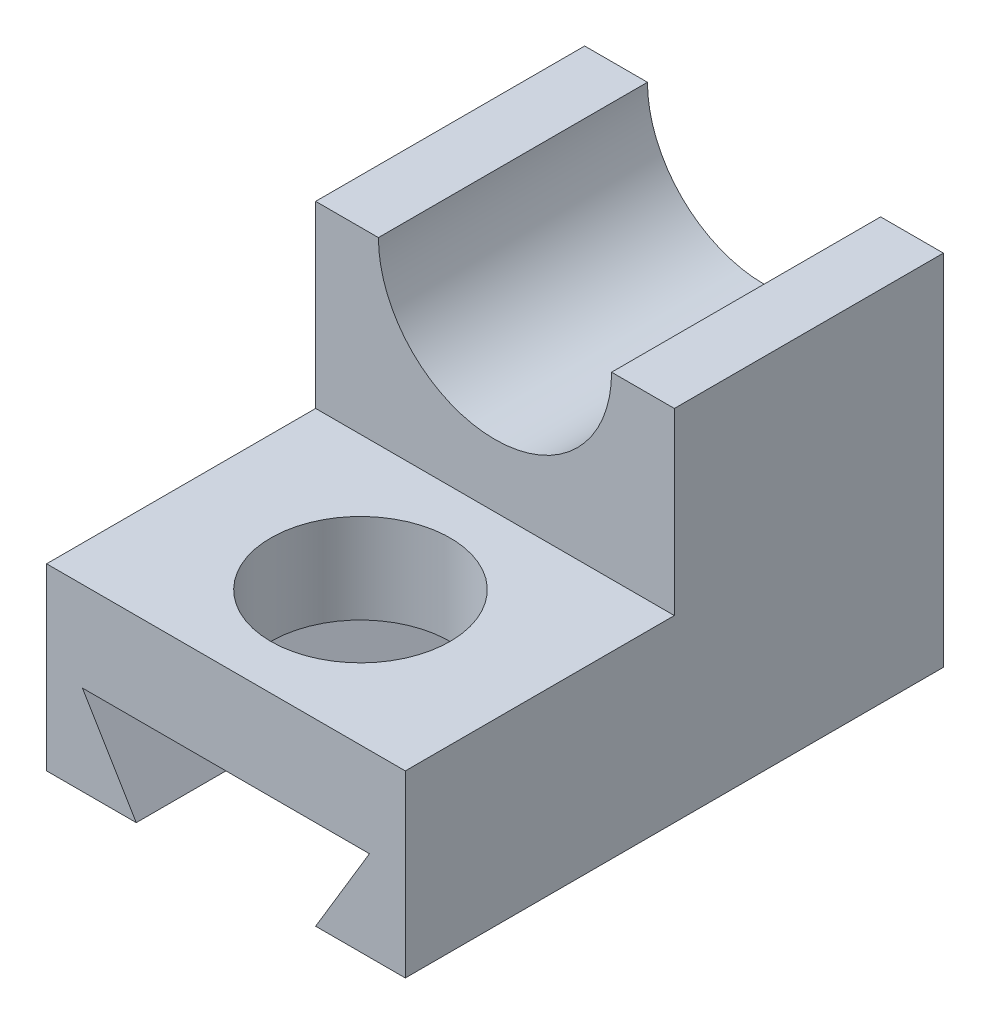
ISO-10303-21;
HEADER;
FILE_DESCRIPTION(('STEP AP214'),'2;1');
FILE_NAME('part.step','',(''),(''),'','','');
FILE_SCHEMA(('AUTOMOTIVE_DESIGN { 1 0 10303 214 1 1 1 1 }'));
ENDSEC;
DATA;
#1=APPLICATION_CONTEXT('core data for automotive mechanical design processes');
#2=APPLICATION_PROTOCOL_DEFINITION('international standard','automotive_design',2000,#1);
#3=PRODUCT_CONTEXT('',#1,'mechanical');
#4=PRODUCT('Part','Part','',(#3));
#5=PRODUCT_RELATED_PRODUCT_CATEGORY('part','',(#4));
#6=PRODUCT_DEFINITION_FORMATION('','',#4);
#7=PRODUCT_DEFINITION_CONTEXT('part definition',#1,'design');
#8=PRODUCT_DEFINITION('design','',#6,#7);
#9=PRODUCT_DEFINITION_SHAPE('','',#8);
#10=(LENGTH_UNIT() NAMED_UNIT(*) SI_UNIT(.MILLI.,.METRE.));
#11=(NAMED_UNIT(*) PLANE_ANGLE_UNIT() SI_UNIT($,.RADIAN.));
#12=(NAMED_UNIT(*) SI_UNIT($,.STERADIAN.) SOLID_ANGLE_UNIT());
#13=UNCERTAINTY_MEASURE_WITH_UNIT(LENGTH_MEASURE(1.E-05),#10,'distance_accuracy_value','');
#14=(GEOMETRIC_REPRESENTATION_CONTEXT(3) GLOBAL_UNCERTAINTY_ASSIGNED_CONTEXT((#13)) GLOBAL_UNIT_ASSIGNED_CONTEXT((#10,
#11,#12)) REPRESENTATION_CONTEXT('',''));
#15=CARTESIAN_POINT('',(0.,0.,0.));
#16=DIRECTION('',(0.,0.,1.));
#17=DIRECTION('',(1.,0.,0.));
#18=AXIS2_PLACEMENT_3D('',#15,#16,#17);
#19=CARTESIAN_POINT('',(20.,40.,-30.));
#20=DIRECTION('',(0.,-1.,0.));
#21=DIRECTION('',(0.,0.,-1.));
#22=AXIS2_PLACEMENT_3D('',#19,#20,#21);
#23=PLANE('',#22);
#24=DIRECTION('',(-1.,0.,0.));
#25=VECTOR('',#24,1.);
#26=CARTESIAN_POINT('',(20.,40.,-60.));
#27=LINE('',#26,#25);
#28=CARTESIAN_POINT('',(20.,40.,-60.));
#29=VERTEX_POINT('',#28);
#30=CARTESIAN_POINT('',(13.,40.,-60.));
#31=VERTEX_POINT('',#30);
#32=EDGE_CURVE('E154',#29,#31,#27,.T.);
#33=ORIENTED_EDGE('',*,*,#32,.T.);
#34=DIRECTION('',(0.,0.,1.));
#35=VECTOR('',#34,1.);
#36=CARTESIAN_POINT('',(13.,40.,-60.));
#37=LINE('',#36,#35);
#38=CARTESIAN_POINT('',(13.,40.,-30.));
#39=VERTEX_POINT('',#38);
#40=EDGE_CURVE('E139',#31,#39,#37,.T.);
#41=ORIENTED_EDGE('',*,*,#40,.T.);
#42=DIRECTION('',(-1.,0.,0.));
#43=VECTOR('',#42,1.);
#44=CARTESIAN_POINT('',(20.,40.,-30.));
#45=LINE('',#44,#43);
#46=CARTESIAN_POINT('',(20.,40.,-30.));
#47=VERTEX_POINT('',#46);
#48=EDGE_CURVE('E164',#47,#39,#45,.T.);
#49=ORIENTED_EDGE('',*,*,#48,.F.);
#50=DIRECTION('',(0.,0.,1.));
#51=VECTOR('',#50,1.);
#52=CARTESIAN_POINT('',(20.,40.,-30.));
#53=LINE('',#52,#51);
#54=EDGE_CURVE('E160',#29,#47,#53,.T.);
#55=ORIENTED_EDGE('',*,*,#54,.F.);
#56=EDGE_LOOP('',(#33,#41,#49,#55));
#57=FACE_BOUND('',#56,.T.);
#58=ADVANCED_FACE('F45',(#57),#23,.F.);
#59=CARTESIAN_POINT('',(20.,0.,0.));
#60=DIRECTION('',(0.,1.,0.));
#61=DIRECTION('',(0.,0.,1.));
#62=AXIS2_PLACEMENT_3D('',#59,#60,#61);
#63=PLANE('',#62);
#64=DIRECTION('',(-1.,0.,0.));
#65=VECTOR('',#64,1.);
#66=CARTESIAN_POINT('',(20.,0.,-60.));
#67=LINE('',#66,#65);
#68=CARTESIAN_POINT('',(-10.,0.,-60.));
#69=VERTEX_POINT('',#68);
#70=CARTESIAN_POINT('',(-20.,0.,-60.));
#71=VERTEX_POINT('',#70);
#72=EDGE_CURVE('E54',#69,#71,#67,.T.);
#73=ORIENTED_EDGE('',*,*,#72,.F.);
#74=DIRECTION('',(0.,0.,1.));
#75=VECTOR('',#74,1.);
#76=CARTESIAN_POINT('',(-10.,0.,-60.));
#77=LINE('',#76,#75);
#78=CARTESIAN_POINT('',(-10.,0.,-15.));
#79=VERTEX_POINT('',#78);
#80=EDGE_CURVE('E204',#69,#79,#77,.T.);
#81=ORIENTED_EDGE('',*,*,#80,.T.);
#82=CARTESIAN_POINT('',(-10.,0.,0.));
#83=VERTEX_POINT('',#82);
#84=EDGE_CURVE('E69',#79,#83,#77,.T.);
#85=ORIENTED_EDGE('',*,*,#84,.T.);
#86=DIRECTION('',(-1.,0.,0.));
#87=VECTOR('',#86,1.);
#88=CARTESIAN_POINT('',(20.,0.,0.));
#89=LINE('',#88,#87);
#90=CARTESIAN_POINT('',(-20.,0.,0.));
#91=VERTEX_POINT('',#90);
#92=EDGE_CURVE('E181',#83,#91,#89,.T.);
#93=ORIENTED_EDGE('',*,*,#92,.T.);
#94=DIRECTION('',(0.,0.,-1.));
#95=VECTOR('',#94,1.);
#96=CARTESIAN_POINT('',(-20.,0.,0.));
#97=LINE('',#96,#95);
#98=EDGE_CURVE('E200',#91,#71,#97,.T.);
#99=ORIENTED_EDGE('',*,*,#98,.T.);
#100=EDGE_LOOP('',(#73,#81,#85,#93,#99));
#101=FACE_BOUND('',#100,.T.);
#102=ADVANCED_FACE('F313',(#101),#63,.F.);
#103=CARTESIAN_POINT('',(20.,0.,0.));
#104=VERTEX_POINT('',#103);
#105=CARTESIAN_POINT('',(10.,0.,0.));
#106=VERTEX_POINT('',#105);
#107=EDGE_CURVE('E177',#104,#106,#89,.T.);
#108=ORIENTED_EDGE('',*,*,#107,.T.);
#109=DIRECTION('',(0.,0.,1.));
#110=VECTOR('',#109,1.);
#111=CARTESIAN_POINT('',(10.,0.,-60.));
#112=LINE('',#111,#110);
#113=CARTESIAN_POINT('',(10.,0.,-15.));
#114=VERTEX_POINT('',#113);
#115=EDGE_CURVE('E227',#114,#106,#112,.T.);
#116=ORIENTED_EDGE('',*,*,#115,.F.);
#117=CARTESIAN_POINT('',(10.,0.,-60.));
#118=VERTEX_POINT('',#117);
#119=EDGE_CURVE('E222',#118,#114,#112,.T.);
#120=ORIENTED_EDGE('',*,*,#119,.F.);
#121=CARTESIAN_POINT('',(20.,0.,-60.));
#122=VERTEX_POINT('',#121);
#123=EDGE_CURVE('E11',#122,#118,#67,.T.);
#124=ORIENTED_EDGE('',*,*,#123,.F.);
#125=DIRECTION('',(0.,0.,-1.));
#126=VECTOR('',#125,1.);
#127=CARTESIAN_POINT('',(20.,0.,0.));
#128=LINE('',#127,#126);
#129=EDGE_CURVE('E186',#104,#122,#128,.T.);
#130=ORIENTED_EDGE('',*,*,#129,.F.);
#131=EDGE_LOOP('',(#108,#116,#120,#124,#130));
#132=FACE_BOUND('',#131,.T.);
#133=ADVANCED_FACE('F47',(#132),#63,.F.);
#134=CARTESIAN_POINT('',(20.,0.,-60.));
#135=DIRECTION('',(0.,0.,1.));
#136=DIRECTION('',(1.,0.,0.));
#137=AXIS2_PLACEMENT_3D('',#134,#135,#136);
#138=PLANE('',#137);
#139=CARTESIAN_POINT('',(-13.,40.,-60.));
#140=VERTEX_POINT('',#139);
#141=CARTESIAN_POINT('',(-20.,40.,-60.));
#142=VERTEX_POINT('',#141);
#143=EDGE_CURVE('E157',#140,#142,#27,.T.);
#144=ORIENTED_EDGE('',*,*,#143,.F.);
#145=CARTESIAN_POINT('',(0.,40.,-60.));
#146=DIRECTION('',(0.,0.,1.));
#147=DIRECTION('',(1.,0.,0.));
#148=AXIS2_PLACEMENT_3D('',#145,#146,#147);
#149=CIRCLE('',#148,13.);
#150=EDGE_CURVE('E142',#140,#31,#149,.T.);
#151=ORIENTED_EDGE('',*,*,#150,.T.);
#152=ORIENTED_EDGE('',*,*,#32,.F.);
#153=DIRECTION('',(0.,1.,0.));
#154=VECTOR('',#153,1.);
#155=CARTESIAN_POINT('',(20.,0.,-60.));
#156=LINE('',#155,#154);
#157=EDGE_CURVE('E216',#122,#29,#156,.T.);
#158=ORIENTED_EDGE('',*,*,#157,.F.);
#159=ORIENTED_EDGE('',*,*,#123,.T.);
#160=DIRECTION('',(0.514495755427527,0.857492925712544,0.));
#161=VECTOR('',#160,1.);
#162=CARTESIAN_POINT('',(10.,0.,-60.));
#163=LINE('',#162,#161);
#164=CARTESIAN_POINT('',(16.,10.,-60.));
#165=VERTEX_POINT('',#164);
#166=EDGE_CURVE('E238',#118,#165,#163,.T.);
#167=ORIENTED_EDGE('',*,*,#166,.T.);
#168=DIRECTION('',(-1.,0.,0.));
#169=VECTOR('',#168,1.);
#170=CARTESIAN_POINT('',(16.,10.,-60.));
#171=LINE('',#170,#169);
#172=CARTESIAN_POINT('',(-16.,10.,-60.));
#173=VERTEX_POINT('',#172);
#174=EDGE_CURVE('E252',#165,#173,#171,.T.);
#175=ORIENTED_EDGE('',*,*,#174,.T.);
#176=DIRECTION('',(0.514495755427527,-0.857492925712544,0.));
#177=VECTOR('',#176,1.);
#178=CARTESIAN_POINT('',(-10.,0.,-60.));
#179=LINE('',#178,#177);
#180=EDGE_CURVE('E248',#173,#69,#179,.T.);
#181=ORIENTED_EDGE('',*,*,#180,.T.);
#182=ORIENTED_EDGE('',*,*,#72,.T.);
#183=DIRECTION('',(0.,1.,0.));
#184=VECTOR('',#183,1.);
#185=CARTESIAN_POINT('',(-20.,0.,-60.));
#186=LINE('',#185,#184);
#187=EDGE_CURVE('E197',#71,#142,#186,.T.);
#188=ORIENTED_EDGE('',*,*,#187,.T.);
#189=EDGE_LOOP('',(#144,#151,#152,#158,#159,#167,#175,#181,#182,#188));
#190=FACE_BOUND('',#189,.T.);
#191=ADVANCED_FACE('F153',(#190),#138,.F.);
#192=CARTESIAN_POINT('',(-13.,40.,-30.));
#193=VERTEX_POINT('',#192);
#194=CARTESIAN_POINT('',(-20.,40.,-30.));
#195=VERTEX_POINT('',#194);
#196=EDGE_CURVE('E168',#193,#195,#45,.T.);
#197=ORIENTED_EDGE('',*,*,#196,.F.);
#198=DIRECTION('',(0.,0.,1.));
#199=VECTOR('',#198,1.);
#200=CARTESIAN_POINT('',(-13.,40.,-60.));
#201=LINE('',#200,#199);
#202=EDGE_CURVE('E61',#140,#193,#201,.T.);
#203=ORIENTED_EDGE('',*,*,#202,.F.);
#204=ORIENTED_EDGE('',*,*,#143,.T.);
#205=DIRECTION('',(0.,0.,1.));
#206=VECTOR('',#205,1.);
#207=CARTESIAN_POINT('',(-20.,40.,-30.));
#208=LINE('',#207,#206);
#209=EDGE_CURVE('E193',#142,#195,#208,.T.);
#210=ORIENTED_EDGE('',*,*,#209,.T.);
#211=EDGE_LOOP('',(#197,#203,#204,#210));
#212=FACE_BOUND('',#211,.T.);
#213=ADVANCED_FACE('F280',(#212),#23,.F.);
#214=CARTESIAN_POINT('',(20.,20.,-30.));
#215=DIRECTION('',(0.,0.,-1.));
#216=DIRECTION('',(-1.,0.,0.));
#217=AXIS2_PLACEMENT_3D('',#214,#215,#216);
#218=PLANE('',#217);
#219=ORIENTED_EDGE('',*,*,#48,.T.);
#220=CARTESIAN_POINT('',(0.,40.,-30.));
#221=DIRECTION('',(0.,0.,1.));
#222=DIRECTION('',(1.,0.,0.));
#223=AXIS2_PLACEMENT_3D('',#220,#221,#222);
#224=CIRCLE('',#223,13.);
#225=EDGE_CURVE('E143',#193,#39,#224,.T.);
#226=ORIENTED_EDGE('',*,*,#225,.F.);
#227=ORIENTED_EDGE('',*,*,#196,.T.);
#228=DIRECTION('',(0.,-1.,0.));
#229=VECTOR('',#228,1.);
#230=CARTESIAN_POINT('',(-20.,20.,-30.));
#231=LINE('',#230,#229);
#232=CARTESIAN_POINT('',(-20.,20.,-30.));
#233=VERTEX_POINT('',#232);
#234=EDGE_CURVE('E190',#195,#233,#231,.T.);
#235=ORIENTED_EDGE('',*,*,#234,.T.);
#236=DIRECTION('',(-1.,0.,0.));
#237=VECTOR('',#236,1.);
#238=CARTESIAN_POINT('',(20.,20.,-30.));
#239=LINE('',#238,#237);
#240=CARTESIAN_POINT('',(20.,20.,-30.));
#241=VERTEX_POINT('',#240);
#242=EDGE_CURVE('E169',#241,#233,#239,.T.);
#243=ORIENTED_EDGE('',*,*,#242,.F.);
#244=DIRECTION('',(0.,-1.,0.));
#245=VECTOR('',#244,1.);
#246=CARTESIAN_POINT('',(20.,20.,-30.));
#247=LINE('',#246,#245);
#248=EDGE_CURVE('E211',#47,#241,#247,.T.);
#249=ORIENTED_EDGE('',*,*,#248,.F.);
#250=EDGE_LOOP('',(#219,#226,#227,#235,#243,#249));
#251=FACE_BOUND('',#250,.T.);
#252=ADVANCED_FACE('F275',(#251),#218,.F.);
#253=CARTESIAN_POINT('',(20.,20.,0.));
#254=DIRECTION('',(0.,-1.,0.));
#255=DIRECTION('',(0.,0.,-1.));
#256=AXIS2_PLACEMENT_3D('',#253,#254,#255);
#257=PLANE('',#256);
#258=CARTESIAN_POINT('',(0.,20.,-15.));
#259=DIRECTION('',(0.,1.,0.));
#260=DIRECTION('',(0.,0.,1.));
#261=AXIS2_PLACEMENT_3D('',#258,#259,#260);
#262=CIRCLE('',#261,10.);
#263=CARTESIAN_POINT('',(0.,20.,-5.));
#264=VERTEX_POINT('',#263);
#265=EDGE_CURVE('E262',#264,#264,#262,.T.);
#266=ORIENTED_EDGE('',*,*,#265,.F.);
#267=EDGE_LOOP('',(#266));
#268=FACE_BOUND('',#267,.T.);
#269=DIRECTION('',(0.,0.,1.));
#270=VECTOR('',#269,1.);
#271=CARTESIAN_POINT('',(-20.,20.,0.));
#272=LINE('',#271,#270);
#273=CARTESIAN_POINT('',(-20.,20.,0.));
#274=VERTEX_POINT('',#273);
#275=EDGE_CURVE('E187',#233,#274,#272,.T.);
#276=ORIENTED_EDGE('',*,*,#275,.T.);
#277=DIRECTION('',(-1.,0.,0.));
#278=VECTOR('',#277,1.);
#279=CARTESIAN_POINT('',(20.,20.,0.));
#280=LINE('',#279,#278);
#281=CARTESIAN_POINT('',(20.,20.,0.));
#282=VERTEX_POINT('',#281);
#283=EDGE_CURVE('E173',#282,#274,#280,.T.);
#284=ORIENTED_EDGE('',*,*,#283,.F.);
#285=DIRECTION('',(0.,0.,1.));
#286=VECTOR('',#285,1.);
#287=CARTESIAN_POINT('',(20.,20.,0.));
#288=LINE('',#287,#286);
#289=EDGE_CURVE('E208',#241,#282,#288,.T.);
#290=ORIENTED_EDGE('',*,*,#289,.F.);
#291=ORIENTED_EDGE('',*,*,#242,.T.);
#292=EDGE_LOOP('',(#276,#284,#290,#291));
#293=FACE_BOUND('',#292,.T.);
#294=ADVANCED_FACE('F289',(#268,#293),#257,.F.);
#295=CARTESIAN_POINT('',(20.,0.,0.));
#296=DIRECTION('',(0.,0.,-1.));
#297=DIRECTION('',(-1.,0.,0.));
#298=AXIS2_PLACEMENT_3D('',#295,#296,#297);
#299=PLANE('',#298);
#300=ORIENTED_EDGE('',*,*,#92,.F.);
#301=DIRECTION('',(0.514495755427527,-0.857492925712544,0.));
#302=VECTOR('',#301,1.);
#303=CARTESIAN_POINT('',(-10.,0.,0.));
#304=LINE('',#303,#302);
#305=CARTESIAN_POINT('',(-16.,10.,0.));
#306=VERTEX_POINT('',#305);
#307=EDGE_CURVE('E235',#306,#83,#304,.T.);
#308=ORIENTED_EDGE('',*,*,#307,.F.);
#309=DIRECTION('',(-1.,0.,0.));
#310=VECTOR('',#309,1.);
#311=CARTESIAN_POINT('',(16.,10.,0.));
#312=LINE('',#311,#310);
#313=CARTESIAN_POINT('',(16.,10.,0.));
#314=VERTEX_POINT('',#313);
#315=EDGE_CURVE('E239',#314,#306,#312,.T.);
#316=ORIENTED_EDGE('',*,*,#315,.F.);
#317=DIRECTION('',(0.514495755427527,0.857492925712544,0.));
#318=VECTOR('',#317,1.);
#319=CARTESIAN_POINT('',(10.,0.,0.));
#320=LINE('',#319,#318);
#321=EDGE_CURVE('E243',#106,#314,#320,.T.);
#322=ORIENTED_EDGE('',*,*,#321,.F.);
#323=ORIENTED_EDGE('',*,*,#107,.F.);
#324=DIRECTION('',(0.,-1.,0.));
#325=VECTOR('',#324,1.);
#326=CARTESIAN_POINT('',(20.,0.,0.));
#327=LINE('',#326,#325);
#328=EDGE_CURVE('E205',#282,#104,#327,.T.);
#329=ORIENTED_EDGE('',*,*,#328,.F.);
#330=ORIENTED_EDGE('',*,*,#283,.T.);
#331=DIRECTION('',(0.,-1.,0.));
#332=VECTOR('',#331,1.);
#333=CARTESIAN_POINT('',(-20.,0.,0.));
#334=LINE('',#333,#332);
#335=EDGE_CURVE('E182',#274,#91,#334,.T.);
#336=ORIENTED_EDGE('',*,*,#335,.T.);
#337=EDGE_LOOP('',(#300,#308,#316,#322,#323,#329,#330,#336));
#338=FACE_BOUND('',#337,.T.);
#339=ADVANCED_FACE('F294',(#338),#299,.F.);
#340=CARTESIAN_POINT('',(20.,0.,0.));
#341=DIRECTION('',(1.,0.,0.));
#342=DIRECTION('',(0.,0.,-1.));
#343=AXIS2_PLACEMENT_3D('',#340,#341,#342);
#344=PLANE('',#343);
#345=ORIENTED_EDGE('',*,*,#129,.T.);
#346=ORIENTED_EDGE('',*,*,#157,.T.);
#347=ORIENTED_EDGE('',*,*,#54,.T.);
#348=ORIENTED_EDGE('',*,*,#248,.T.);
#349=ORIENTED_EDGE('',*,*,#289,.T.);
#350=ORIENTED_EDGE('',*,*,#328,.T.);
#351=EDGE_LOOP('',(#345,#346,#347,#348,#349,#350));
#352=FACE_BOUND('',#351,.T.);
#353=ADVANCED_FACE('F299',(#352),#344,.T.);
#354=CARTESIAN_POINT('',(-20.,0.,0.));
#355=DIRECTION('',(1.,0.,0.));
#356=DIRECTION('',(0.,0.,-1.));
#357=AXIS2_PLACEMENT_3D('',#354,#355,#356);
#358=PLANE('',#357);
#359=ORIENTED_EDGE('',*,*,#98,.F.);
#360=ORIENTED_EDGE('',*,*,#335,.F.);
#361=ORIENTED_EDGE('',*,*,#275,.F.);
#362=ORIENTED_EDGE('',*,*,#234,.F.);
#363=ORIENTED_EDGE('',*,*,#209,.F.);
#364=ORIENTED_EDGE('',*,*,#187,.F.);
#365=EDGE_LOOP('',(#359,#360,#361,#362,#363,#364));
#366=FACE_BOUND('',#365,.T.);
#367=ADVANCED_FACE('F285',(#366),#358,.F.);
#368=CARTESIAN_POINT('',(-10.,0.,-60.));
#369=DIRECTION('',(-0.857492925712544,-0.514495755427526,0.));
#370=DIRECTION('',(0.514495755427527,-0.857492925712544,0.));
#371=AXIS2_PLACEMENT_3D('',#368,#369,#370);
#372=PLANE('',#371);
#373=ORIENTED_EDGE('',*,*,#307,.T.);
#374=ORIENTED_EDGE('',*,*,#84,.F.);
#375=ORIENTED_EDGE('',*,*,#80,.F.);
#376=ORIENTED_EDGE('',*,*,#180,.F.);
#377=DIRECTION('',(0.,0.,1.));
#378=VECTOR('',#377,1.);
#379=CARTESIAN_POINT('',(-16.,10.,-60.));
#380=LINE('',#379,#378);
#381=EDGE_CURVE('E230',#173,#306,#380,.T.);
#382=ORIENTED_EDGE('',*,*,#381,.T.);
#383=EDGE_LOOP('',(#373,#374,#375,#376,#382));
#384=FACE_BOUND('',#383,.T.);
#385=ADVANCED_FACE('F315',(#384),#372,.F.);
#386=CARTESIAN_POINT('',(16.,10.,-60.));
#387=DIRECTION('',(0.,1.,0.));
#388=DIRECTION('',(0.,0.,1.));
#389=AXIS2_PLACEMENT_3D('',#386,#387,#388);
#390=PLANE('',#389);
#391=CARTESIAN_POINT('',(0.,10.,-15.));
#392=DIRECTION('',(0.,1.,0.));
#393=DIRECTION('',(0.,0.,1.));
#394=AXIS2_PLACEMENT_3D('',#391,#392,#393);
#395=CIRCLE('',#394,10.);
#396=CARTESIAN_POINT('',(0.,10.,-5.));
#397=VERTEX_POINT('',#396);
#398=EDGE_CURVE('E247',#397,#397,#395,.T.);
#399=ORIENTED_EDGE('',*,*,#398,.T.);
#400=EDGE_LOOP('',(#399));
#401=FACE_BOUND('',#400,.T.);
#402=ORIENTED_EDGE('',*,*,#315,.T.);
#403=ORIENTED_EDGE('',*,*,#381,.F.);
#404=ORIENTED_EDGE('',*,*,#174,.F.);
#405=DIRECTION('',(0.,0.,1.));
#406=VECTOR('',#405,1.);
#407=CARTESIAN_POINT('',(16.,10.,-60.));
#408=LINE('',#407,#406);
#409=EDGE_CURVE('E226',#165,#314,#408,.T.);
#410=ORIENTED_EDGE('',*,*,#409,.T.);
#411=EDGE_LOOP('',(#402,#403,#404,#410));
#412=FACE_BOUND('',#411,.T.);
#413=ADVANCED_FACE('F309',(#401,#412),#390,.F.);
#414=CARTESIAN_POINT('',(10.,0.,-60.));
#415=DIRECTION('',(0.857492925712544,-0.514495755427526,0.));
#416=DIRECTION('',(0.514495755427527,0.857492925712544,0.));
#417=AXIS2_PLACEMENT_3D('',#414,#415,#416);
#418=PLANE('',#417);
#419=ORIENTED_EDGE('',*,*,#321,.T.);
#420=ORIENTED_EDGE('',*,*,#409,.F.);
#421=ORIENTED_EDGE('',*,*,#166,.F.);
#422=ORIENTED_EDGE('',*,*,#119,.T.);
#423=ORIENTED_EDGE('',*,*,#115,.T.);
#424=EDGE_LOOP('',(#419,#420,#421,#422,#423));
#425=FACE_BOUND('',#424,.T.);
#426=ADVANCED_FACE('F305',(#425),#418,.F.);
#427=CARTESIAN_POINT('',(0.,0.,-15.));
#428=DIRECTION('',(0.,1.,0.));
#429=DIRECTION('',(0.,0.,1.));
#430=AXIS2_PLACEMENT_3D('',#427,#428,#429);
#431=CYLINDRICAL_SURFACE('',#430,10.);
#432=ORIENTED_EDGE('',*,*,#265,.T.);
#433=EDGE_LOOP('',(#432));
#434=FACE_BOUND('',#433,.T.);
#435=ORIENTED_EDGE('',*,*,#398,.F.);
#436=EDGE_LOOP('',(#435));
#437=FACE_BOUND('',#436,.T.);
#438=ADVANCED_FACE('F403',(#434,#437),#431,.F.);
#439=CARTESIAN_POINT('',(0.,40.,-60.));
#440=DIRECTION('',(0.,0.,1.));
#441=DIRECTION('',(1.,0.,0.));
#442=AXIS2_PLACEMENT_3D('',#439,#440,#441);
#443=CYLINDRICAL_SURFACE('',#442,13.);
#444=ORIENTED_EDGE('',*,*,#225,.T.);
#445=ORIENTED_EDGE('',*,*,#40,.F.);
#446=ORIENTED_EDGE('',*,*,#150,.F.);
#447=ORIENTED_EDGE('',*,*,#202,.T.);
#448=EDGE_LOOP('',(#444,#445,#446,#447));
#449=FACE_BOUND('',#448,.T.);
#450=ADVANCED_FACE('F141',(#449),#443,.F.);
#451=CLOSED_SHELL('',(#58,#102,#133,#191,#213,#252,#294,#339,#353,#367,#385,#413,#426,#438,#450));
#452=MANIFOLD_SOLID_BREP('B2',#451);
#453=ADVANCED_BREP_SHAPE_REPRESENTATION('',(#18,#452),#14);
#454=SHAPE_DEFINITION_REPRESENTATION(#9,#453);
ENDSEC;
END-ISO-10303-21;
